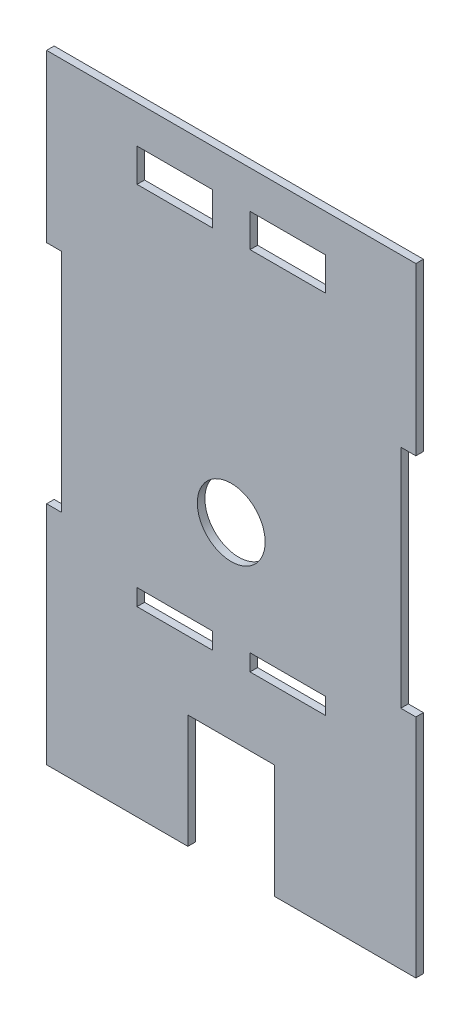
ISO-10303-21;
HEADER;
FILE_DESCRIPTION(('STEP AP214'),'2;1');
FILE_NAME('part.step','',(''),(''),'','','');
FILE_SCHEMA(('AUTOMOTIVE_DESIGN { 1 0 10303 214 1 1 1 1 }'));
ENDSEC;
DATA;
#1=APPLICATION_CONTEXT('core data for automotive mechanical design processes');
#2=APPLICATION_PROTOCOL_DEFINITION('international standard','automotive_design',2000,#1);
#3=PRODUCT_CONTEXT('',#1,'mechanical');
#4=PRODUCT('Part','Part','',(#3));
#5=PRODUCT_RELATED_PRODUCT_CATEGORY('part','',(#4));
#6=PRODUCT_DEFINITION_FORMATION('','',#4);
#7=PRODUCT_DEFINITION_CONTEXT('part definition',#1,'design');
#8=PRODUCT_DEFINITION('design','',#6,#7);
#9=PRODUCT_DEFINITION_SHAPE('','',#8);
#10=(LENGTH_UNIT() NAMED_UNIT(*) SI_UNIT(.MILLI.,.METRE.));
#11=(NAMED_UNIT(*) PLANE_ANGLE_UNIT() SI_UNIT($,.RADIAN.));
#12=(NAMED_UNIT(*) SI_UNIT($,.STERADIAN.) SOLID_ANGLE_UNIT());
#13=UNCERTAINTY_MEASURE_WITH_UNIT(LENGTH_MEASURE(1.E-05),#10,'distance_accuracy_value','');
#14=(GEOMETRIC_REPRESENTATION_CONTEXT(3) GLOBAL_UNCERTAINTY_ASSIGNED_CONTEXT((#13)) GLOBAL_UNIT_ASSIGNED_CONTEXT((#10,
#11,#12)) REPRESENTATION_CONTEXT('',''));
#15=CARTESIAN_POINT('',(0.,0.,0.));
#16=DIRECTION('',(0.,0.,1.));
#17=DIRECTION('',(1.,0.,0.));
#18=AXIS2_PLACEMENT_3D('',#15,#16,#17);
#19=CARTESIAN_POINT('',(0.,85.7257281459209,1.));
#20=DIRECTION('',(0.,1.,0.));
#21=DIRECTION('',(0.,0.,1.));
#22=AXIS2_PLACEMENT_3D('',#19,#20,#21);
#23=PLANE('',#22);
#24=DIRECTION('',(1.,0.,0.));
#25=VECTOR('',#24,1.);
#26=CARTESIAN_POINT('',(0.,85.7257281459209,0.));
#27=LINE('',#26,#25);
#28=CARTESIAN_POINT('',(4.03101287265116,85.7257281459209,0.));
#29=VERTEX_POINT('',#28);
#30=CARTESIAN_POINT('',(53.0310128726682,85.7257281459209,0.));
#31=VERTEX_POINT('',#30);
#32=EDGE_CURVE('E354',#29,#31,#27,.T.);
#33=ORIENTED_EDGE('',*,*,#32,.F.);
#34=DIRECTION('',(0.,0.,-1.));
#35=VECTOR('',#34,1.);
#36=CARTESIAN_POINT('',(4.03101287265116,85.7257281459209,1.));
#37=LINE('',#36,#35);
#38=CARTESIAN_POINT('',(4.03101287265116,85.7257281459209,1.));
#39=VERTEX_POINT('',#38);
#40=EDGE_CURVE('E11',#39,#29,#37,.T.);
#41=ORIENTED_EDGE('',*,*,#40,.F.);
#42=DIRECTION('',(1.,0.,0.));
#43=VECTOR('',#42,1.);
#44=CARTESIAN_POINT('',(0.,85.7257281459209,1.));
#45=LINE('',#44,#43);
#46=CARTESIAN_POINT('',(53.0310128726682,85.7257281459209,1.));
#47=VERTEX_POINT('',#46);
#48=EDGE_CURVE('E576',#39,#47,#45,.T.);
#49=ORIENTED_EDGE('',*,*,#48,.T.);
#50=DIRECTION('',(0.,0.,-1.));
#51=VECTOR('',#50,1.);
#52=CARTESIAN_POINT('',(53.0310128726682,85.7257281459209,1.));
#53=LINE('',#52,#51);
#54=EDGE_CURVE('E59',#47,#31,#53,.T.);
#55=ORIENTED_EDGE('',*,*,#54,.T.);
#56=EDGE_LOOP('',(#33,#41,#49,#55));
#57=FACE_BOUND('',#56,.T.);
#58=ADVANCED_FACE('F39',(#57),#23,.T.);
#59=CARTESIAN_POINT('',(4.03101287265116,0.,1.));
#60=DIRECTION('',(1.,0.,0.));
#61=DIRECTION('',(0.,0.,-1.));
#62=AXIS2_PLACEMENT_3D('',#59,#60,#61);
#63=PLANE('',#62);
#64=DIRECTION('',(0.,-1.,0.));
#65=VECTOR('',#64,1.);
#66=CARTESIAN_POINT('',(4.03101287265116,0.,0.));
#67=LINE('',#66,#65);
#68=CARTESIAN_POINT('',(4.03101287265116,63.6240827319113,0.));
#69=VERTEX_POINT('',#68);
#70=EDGE_CURVE('E357',#29,#69,#67,.T.);
#71=ORIENTED_EDGE('',*,*,#70,.T.);
#72=DIRECTION('',(0.,0.,-1.));
#73=VECTOR('',#72,1.);
#74=CARTESIAN_POINT('',(4.03101287265116,63.6240827319113,1.));
#75=LINE('',#74,#73);
#76=CARTESIAN_POINT('',(4.03101287265116,63.6240827319113,1.));
#77=VERTEX_POINT('',#76);
#78=EDGE_CURVE('E50',#77,#69,#75,.T.);
#79=ORIENTED_EDGE('',*,*,#78,.F.);
#80=DIRECTION('',(0.,-1.,0.));
#81=VECTOR('',#80,1.);
#82=CARTESIAN_POINT('',(4.03101287265116,0.,1.));
#83=LINE('',#82,#81);
#84=EDGE_CURVE('E579',#39,#77,#83,.T.);
#85=ORIENTED_EDGE('',*,*,#84,.F.);
#86=ORIENTED_EDGE('',*,*,#40,.T.);
#87=EDGE_LOOP('',(#71,#79,#85,#86));
#88=FACE_BOUND('',#87,.T.);
#89=ADVANCED_FACE('F644',(#88),#63,.F.);
#90=CARTESIAN_POINT('',(0.,63.6240827319113,1.));
#91=DIRECTION('',(0.,1.,0.));
#92=DIRECTION('',(0.,0.,1.));
#93=AXIS2_PLACEMENT_3D('',#90,#91,#92);
#94=PLANE('',#93);
#95=DIRECTION('',(1.,0.,0.));
#96=VECTOR('',#95,1.);
#97=CARTESIAN_POINT('',(0.,63.6240827319113,0.));
#98=LINE('',#97,#96);
#99=CARTESIAN_POINT('',(6.03101287265113,63.6240827319113,0.));
#100=VERTEX_POINT('',#99);
#101=EDGE_CURVE('E361',#69,#100,#98,.T.);
#102=ORIENTED_EDGE('',*,*,#101,.T.);
#103=DIRECTION('',(0.,0.,-1.));
#104=VECTOR('',#103,1.);
#105=CARTESIAN_POINT('',(6.03101287265113,63.6240827319113,1.));
#106=LINE('',#105,#104);
#107=CARTESIAN_POINT('',(6.03101287265113,63.6240827319113,1.));
#108=VERTEX_POINT('',#107);
#109=EDGE_CURVE('E449',#108,#100,#106,.T.);
#110=ORIENTED_EDGE('',*,*,#109,.F.);
#111=DIRECTION('',(1.,0.,0.));
#112=VECTOR('',#111,1.);
#113=CARTESIAN_POINT('',(0.,63.6240827319113,1.));
#114=LINE('',#113,#112);
#115=EDGE_CURVE('E583',#77,#108,#114,.T.);
#116=ORIENTED_EDGE('',*,*,#115,.F.);
#117=ORIENTED_EDGE('',*,*,#78,.T.);
#118=EDGE_LOOP('',(#102,#110,#116,#117));
#119=FACE_BOUND('',#118,.T.);
#120=ADVANCED_FACE('F649',(#119),#94,.F.);
#121=CARTESIAN_POINT('',(6.03101287265113,0.,1.));
#122=DIRECTION('',(1.,0.,0.));
#123=DIRECTION('',(0.,0.,-1.));
#124=AXIS2_PLACEMENT_3D('',#121,#122,#123);
#125=PLANE('',#124);
#126=DIRECTION('',(0.,-1.,0.));
#127=VECTOR('',#126,1.);
#128=CARTESIAN_POINT('',(6.03101287265113,0.,0.));
#129=LINE('',#128,#127);
#130=CARTESIAN_POINT('',(6.03101287265113,33.6240827319122,0.));
#131=VERTEX_POINT('',#130);
#132=EDGE_CURVE('E365',#100,#131,#129,.T.);
#133=ORIENTED_EDGE('',*,*,#132,.T.);
#134=DIRECTION('',(0.,0.,-1.));
#135=VECTOR('',#134,1.);
#136=CARTESIAN_POINT('',(6.03101287265113,33.6240827319122,1.));
#137=LINE('',#136,#135);
#138=CARTESIAN_POINT('',(6.03101287265113,33.6240827319122,1.));
#139=VERTEX_POINT('',#138);
#140=EDGE_CURVE('E446',#139,#131,#137,.T.);
#141=ORIENTED_EDGE('',*,*,#140,.F.);
#142=DIRECTION('',(0.,-1.,0.));
#143=VECTOR('',#142,1.);
#144=CARTESIAN_POINT('',(6.03101287265113,0.,1.));
#145=LINE('',#144,#143);
#146=EDGE_CURVE('E587',#108,#139,#145,.T.);
#147=ORIENTED_EDGE('',*,*,#146,.F.);
#148=ORIENTED_EDGE('',*,*,#109,.T.);
#149=EDGE_LOOP('',(#133,#141,#147,#148));
#150=FACE_BOUND('',#149,.T.);
#151=ADVANCED_FACE('F922',(#150),#125,.F.);
#152=CARTESIAN_POINT('',(0.,33.6240827319122,1.));
#153=DIRECTION('',(0.,1.,0.));
#154=DIRECTION('',(0.,0.,1.));
#155=AXIS2_PLACEMENT_3D('',#152,#153,#154);
#156=PLANE('',#155);
#157=DIRECTION('',(1.,0.,0.));
#158=VECTOR('',#157,1.);
#159=CARTESIAN_POINT('',(0.,33.6240827319122,0.));
#160=LINE('',#159,#158);
#161=CARTESIAN_POINT('',(4.03101287265116,33.6240827319122,0.));
#162=VERTEX_POINT('',#161);
#163=EDGE_CURVE('E369',#162,#131,#160,.T.);
#164=ORIENTED_EDGE('',*,*,#163,.F.);
#165=DIRECTION('',(0.,0.,-1.));
#166=VECTOR('',#165,1.);
#167=CARTESIAN_POINT('',(4.03101287265116,33.6240827319122,1.));
#168=LINE('',#167,#166);
#169=CARTESIAN_POINT('',(4.03101287265116,33.6240827319122,1.));
#170=VERTEX_POINT('',#169);
#171=EDGE_CURVE('E443',#170,#162,#168,.T.);
#172=ORIENTED_EDGE('',*,*,#171,.F.);
#173=DIRECTION('',(1.,0.,0.));
#174=VECTOR('',#173,1.);
#175=CARTESIAN_POINT('',(0.,33.6240827319122,1.));
#176=LINE('',#175,#174);
#177=EDGE_CURVE('E590',#170,#139,#176,.T.);
#178=ORIENTED_EDGE('',*,*,#177,.T.);
#179=ORIENTED_EDGE('',*,*,#140,.T.);
#180=EDGE_LOOP('',(#164,#172,#178,#179));
#181=FACE_BOUND('',#180,.T.);
#182=ADVANCED_FACE('F911',(#181),#156,.T.);
#183=CARTESIAN_POINT('',(4.03101287265116,0.,1.));
#184=DIRECTION('',(1.,0.,0.));
#185=DIRECTION('',(0.,0.,-1.));
#186=AXIS2_PLACEMENT_3D('',#183,#184,#185);
#187=PLANE('',#186);
#188=DIRECTION('',(0.,-1.,0.));
#189=VECTOR('',#188,1.);
#190=CARTESIAN_POINT('',(4.03101287265116,0.,0.));
#191=LINE('',#190,#189);
#192=CARTESIAN_POINT('',(4.03101287265116,3.62408273191132,0.));
#193=VERTEX_POINT('',#192);
#194=EDGE_CURVE('E373',#162,#193,#191,.T.);
#195=ORIENTED_EDGE('',*,*,#194,.T.);
#196=DIRECTION('',(0.,0.,-1.));
#197=VECTOR('',#196,1.);
#198=CARTESIAN_POINT('',(4.03101287265116,3.62408273191132,1.));
#199=LINE('',#198,#197);
#200=CARTESIAN_POINT('',(4.03101287265116,3.62408273191132,1.));
#201=VERTEX_POINT('',#200);
#202=EDGE_CURVE('E440',#201,#193,#199,.T.);
#203=ORIENTED_EDGE('',*,*,#202,.F.);
#204=DIRECTION('',(0.,-1.,0.));
#205=VECTOR('',#204,1.);
#206=CARTESIAN_POINT('',(4.03101287265116,0.,1.));
#207=LINE('',#206,#205);
#208=EDGE_CURVE('E594',#170,#201,#207,.T.);
#209=ORIENTED_EDGE('',*,*,#208,.F.);
#210=ORIENTED_EDGE('',*,*,#171,.T.);
#211=EDGE_LOOP('',(#195,#203,#209,#210));
#212=FACE_BOUND('',#211,.T.);
#213=ADVANCED_FACE('F901',(#212),#187,.F.);
#214=CARTESIAN_POINT('',(0.,3.62408273191132,1.));
#215=DIRECTION('',(0.,-1.,0.));
#216=DIRECTION('',(0.,0.,-1.));
#217=AXIS2_PLACEMENT_3D('',#214,#215,#216);
#218=PLANE('',#217);
#219=DIRECTION('',(-1.,0.,0.));
#220=VECTOR('',#219,1.);
#221=CARTESIAN_POINT('',(0.,3.62408273191132,0.));
#222=LINE('',#221,#220);
#223=CARTESIAN_POINT('',(22.7810128726682,3.62408273191132,0.));
#224=VERTEX_POINT('',#223);
#225=EDGE_CURVE('E377',#224,#193,#222,.T.);
#226=ORIENTED_EDGE('',*,*,#225,.F.);
#227=DIRECTION('',(0.,0.,-1.));
#228=VECTOR('',#227,1.);
#229=CARTESIAN_POINT('',(22.7810128726682,3.62408273191132,1.));
#230=LINE('',#229,#228);
#231=CARTESIAN_POINT('',(22.7810128726682,3.62408273191132,1.));
#232=VERTEX_POINT('',#231);
#233=EDGE_CURVE('E437',#232,#224,#230,.T.);
#234=ORIENTED_EDGE('',*,*,#233,.F.);
#235=DIRECTION('',(-1.,0.,0.));
#236=VECTOR('',#235,1.);
#237=CARTESIAN_POINT('',(0.,3.62408273191132,1.));
#238=LINE('',#237,#236);
#239=EDGE_CURVE('E597',#232,#201,#238,.T.);
#240=ORIENTED_EDGE('',*,*,#239,.T.);
#241=ORIENTED_EDGE('',*,*,#202,.T.);
#242=EDGE_LOOP('',(#226,#234,#240,#241));
#243=FACE_BOUND('',#242,.T.);
#244=ADVANCED_FACE('F891',(#243),#218,.T.);
#245=CARTESIAN_POINT('',(22.7810128726682,0.,1.));
#246=DIRECTION('',(1.,0.,0.));
#247=DIRECTION('',(0.,0.,-1.));
#248=AXIS2_PLACEMENT_3D('',#245,#246,#247);
#249=PLANE('',#248);
#250=DIRECTION('',(0.,-1.,0.));
#251=VECTOR('',#250,1.);
#252=CARTESIAN_POINT('',(22.7810128726682,0.,0.));
#253=LINE('',#252,#251);
#254=CARTESIAN_POINT('',(22.7810128726682,18.7240827319101,0.));
#255=VERTEX_POINT('',#254);
#256=EDGE_CURVE('E381',#255,#224,#253,.T.);
#257=ORIENTED_EDGE('',*,*,#256,.F.);
#258=DIRECTION('',(0.,0.,-1.));
#259=VECTOR('',#258,1.);
#260=CARTESIAN_POINT('',(22.7810128726682,18.7240827319101,1.));
#261=LINE('',#260,#259);
#262=CARTESIAN_POINT('',(22.7810128726682,18.7240827319101,1.));
#263=VERTEX_POINT('',#262);
#264=EDGE_CURVE('E434',#263,#255,#261,.T.);
#265=ORIENTED_EDGE('',*,*,#264,.F.);
#266=DIRECTION('',(0.,-1.,0.));
#267=VECTOR('',#266,1.);
#268=CARTESIAN_POINT('',(22.7810128726682,0.,1.));
#269=LINE('',#268,#267);
#270=EDGE_CURVE('E601',#263,#232,#269,.T.);
#271=ORIENTED_EDGE('',*,*,#270,.T.);
#272=ORIENTED_EDGE('',*,*,#233,.T.);
#273=EDGE_LOOP('',(#257,#265,#271,#272));
#274=FACE_BOUND('',#273,.T.);
#275=ADVANCED_FACE('F880',(#274),#249,.T.);
#276=CARTESIAN_POINT('',(0.,18.7240827319101,1.));
#277=DIRECTION('',(0.,-1.,0.));
#278=DIRECTION('',(0.,0.,-1.));
#279=AXIS2_PLACEMENT_3D('',#276,#277,#278);
#280=PLANE('',#279);
#281=DIRECTION('',(-1.,0.,0.));
#282=VECTOR('',#281,1.);
#283=CARTESIAN_POINT('',(0.,18.7240827319101,0.));
#284=LINE('',#283,#282);
#285=CARTESIAN_POINT('',(34.2810128726686,18.7240827319101,0.));
#286=VERTEX_POINT('',#285);
#287=EDGE_CURVE('E385',#286,#255,#284,.T.);
#288=ORIENTED_EDGE('',*,*,#287,.F.);
#289=DIRECTION('',(0.,0.,-1.));
#290=VECTOR('',#289,1.);
#291=CARTESIAN_POINT('',(34.2810128726686,18.7240827319101,1.));
#292=LINE('',#291,#290);
#293=CARTESIAN_POINT('',(34.2810128726686,18.7240827319101,1.));
#294=VERTEX_POINT('',#293);
#295=EDGE_CURVE('E431',#294,#286,#292,.T.);
#296=ORIENTED_EDGE('',*,*,#295,.F.);
#297=DIRECTION('',(-1.,0.,0.));
#298=VECTOR('',#297,1.);
#299=CARTESIAN_POINT('',(0.,18.7240827319101,1.));
#300=LINE('',#299,#298);
#301=EDGE_CURVE('E605',#294,#263,#300,.T.);
#302=ORIENTED_EDGE('',*,*,#301,.T.);
#303=ORIENTED_EDGE('',*,*,#264,.T.);
#304=EDGE_LOOP('',(#288,#296,#302,#303));
#305=FACE_BOUND('',#304,.T.);
#306=ADVANCED_FACE('F870',(#305),#280,.T.);
#307=CARTESIAN_POINT('',(34.2810128726686,0.,1.));
#308=DIRECTION('',(-1.,0.,0.));
#309=DIRECTION('',(0.,0.,1.));
#310=AXIS2_PLACEMENT_3D('',#307,#308,#309);
#311=PLANE('',#310);
#312=DIRECTION('',(0.,1.,0.));
#313=VECTOR('',#312,1.);
#314=CARTESIAN_POINT('',(34.2810128726686,0.,0.));
#315=LINE('',#314,#313);
#316=CARTESIAN_POINT('',(34.2810128726686,3.62408273191132,0.));
#317=VERTEX_POINT('',#316);
#318=EDGE_CURVE('E389',#317,#286,#315,.T.);
#319=ORIENTED_EDGE('',*,*,#318,.F.);
#320=DIRECTION('',(0.,0.,-1.));
#321=VECTOR('',#320,1.);
#322=CARTESIAN_POINT('',(34.2810128726686,3.62408273191132,1.));
#323=LINE('',#322,#321);
#324=CARTESIAN_POINT('',(34.2810128726686,3.62408273191132,1.));
#325=VERTEX_POINT('',#324);
#326=EDGE_CURVE('E428',#325,#317,#323,.T.);
#327=ORIENTED_EDGE('',*,*,#326,.F.);
#328=DIRECTION('',(0.,1.,0.));
#329=VECTOR('',#328,1.);
#330=CARTESIAN_POINT('',(34.2810128726686,0.,1.));
#331=LINE('',#330,#329);
#332=EDGE_CURVE('E609',#325,#294,#331,.T.);
#333=ORIENTED_EDGE('',*,*,#332,.T.);
#334=ORIENTED_EDGE('',*,*,#295,.T.);
#335=EDGE_LOOP('',(#319,#327,#333,#334));
#336=FACE_BOUND('',#335,.T.);
#337=ADVANCED_FACE('F861',(#336),#311,.T.);
#338=CARTESIAN_POINT('',(0.,3.62408273191132,1.));
#339=DIRECTION('',(0.,-1.,0.));
#340=DIRECTION('',(0.,0.,-1.));
#341=AXIS2_PLACEMENT_3D('',#338,#339,#340);
#342=PLANE('',#341);
#343=DIRECTION('',(-1.,0.,0.));
#344=VECTOR('',#343,1.);
#345=CARTESIAN_POINT('',(0.,3.62408273191132,0.));
#346=LINE('',#345,#344);
#347=CARTESIAN_POINT('',(53.0310128726682,3.62408273191132,0.));
#348=VERTEX_POINT('',#347);
#349=EDGE_CURVE('E393',#348,#317,#346,.T.);
#350=ORIENTED_EDGE('',*,*,#349,.F.);
#351=DIRECTION('',(0.,0.,-1.));
#352=VECTOR('',#351,1.);
#353=CARTESIAN_POINT('',(53.0310128726682,3.62408273191132,1.));
#354=LINE('',#353,#352);
#355=CARTESIAN_POINT('',(53.0310128726682,3.62408273191132,1.));
#356=VERTEX_POINT('',#355);
#357=EDGE_CURVE('E425',#356,#348,#354,.T.);
#358=ORIENTED_EDGE('',*,*,#357,.F.);
#359=DIRECTION('',(-1.,0.,0.));
#360=VECTOR('',#359,1.);
#361=CARTESIAN_POINT('',(0.,3.62408273191132,1.));
#362=LINE('',#361,#360);
#363=EDGE_CURVE('E613',#356,#325,#362,.T.);
#364=ORIENTED_EDGE('',*,*,#363,.T.);
#365=ORIENTED_EDGE('',*,*,#326,.T.);
#366=EDGE_LOOP('',(#350,#358,#364,#365));
#367=FACE_BOUND('',#366,.T.);
#368=ADVANCED_FACE('F629',(#367),#342,.T.);
#369=CARTESIAN_POINT('',(53.0310128726682,0.,1.));
#370=DIRECTION('',(1.,0.,0.));
#371=DIRECTION('',(0.,0.,-1.));
#372=AXIS2_PLACEMENT_3D('',#369,#370,#371);
#373=PLANE('',#372);
#374=DIRECTION('',(0.,-1.,0.));
#375=VECTOR('',#374,1.);
#376=CARTESIAN_POINT('',(53.0310128726682,0.,0.));
#377=LINE('',#376,#375);
#378=CARTESIAN_POINT('',(53.0310128726682,33.6240827319122,0.));
#379=VERTEX_POINT('',#378);
#380=EDGE_CURVE('E397',#379,#348,#377,.T.);
#381=ORIENTED_EDGE('',*,*,#380,.F.);
#382=DIRECTION('',(0.,0.,-1.));
#383=VECTOR('',#382,1.);
#384=CARTESIAN_POINT('',(53.0310128726682,33.6240827319122,1.));
#385=LINE('',#384,#383);
#386=CARTESIAN_POINT('',(53.0310128726682,33.6240827319122,1.));
#387=VERTEX_POINT('',#386);
#388=EDGE_CURVE('E422',#387,#379,#385,.T.);
#389=ORIENTED_EDGE('',*,*,#388,.F.);
#390=DIRECTION('',(0.,-1.,0.));
#391=VECTOR('',#390,1.);
#392=CARTESIAN_POINT('',(53.0310128726682,0.,1.));
#393=LINE('',#392,#391);
#394=EDGE_CURVE('E617',#387,#356,#393,.T.);
#395=ORIENTED_EDGE('',*,*,#394,.T.);
#396=ORIENTED_EDGE('',*,*,#357,.T.);
#397=EDGE_LOOP('',(#381,#389,#395,#396));
#398=FACE_BOUND('',#397,.T.);
#399=ADVANCED_FACE('F623',(#398),#373,.T.);
#400=CARTESIAN_POINT('',(0.,33.6240827319122,1.));
#401=DIRECTION('',(0.,-1.,0.));
#402=DIRECTION('',(0.,0.,-1.));
#403=AXIS2_PLACEMENT_3D('',#400,#401,#402);
#404=PLANE('',#403);
#405=DIRECTION('',(-1.,0.,0.));
#406=VECTOR('',#405,1.);
#407=CARTESIAN_POINT('',(0.,33.6240827319122,0.));
#408=LINE('',#407,#406);
#409=CARTESIAN_POINT('',(51.0310128726686,33.6240827319122,0.));
#410=VERTEX_POINT('',#409);
#411=EDGE_CURVE('E401',#379,#410,#408,.T.);
#412=ORIENTED_EDGE('',*,*,#411,.T.);
#413=DIRECTION('',(0.,0.,-1.));
#414=VECTOR('',#413,1.);
#415=CARTESIAN_POINT('',(51.0310128726686,33.6240827319122,1.));
#416=LINE('',#415,#414);
#417=CARTESIAN_POINT('',(51.0310128726686,33.6240827319122,1.));
#418=VERTEX_POINT('',#417);
#419=EDGE_CURVE('E267',#418,#410,#416,.T.);
#420=ORIENTED_EDGE('',*,*,#419,.F.);
#421=DIRECTION('',(-1.,0.,0.));
#422=VECTOR('',#421,1.);
#423=CARTESIAN_POINT('',(0.,33.6240827319122,1.));
#424=LINE('',#423,#422);
#425=EDGE_CURVE('E277',#387,#418,#424,.T.);
#426=ORIENTED_EDGE('',*,*,#425,.F.);
#427=ORIENTED_EDGE('',*,*,#388,.T.);
#428=EDGE_LOOP('',(#412,#420,#426,#427));
#429=FACE_BOUND('',#428,.T.);
#430=ADVANCED_FACE('F634',(#429),#404,.F.);
#431=CARTESIAN_POINT('',(51.0310128726686,0.,1.));
#432=DIRECTION('',(1.,0.,0.));
#433=DIRECTION('',(0.,0.,-1.));
#434=AXIS2_PLACEMENT_3D('',#431,#432,#433);
#435=PLANE('',#434);
#436=DIRECTION('',(0.,-1.,0.));
#437=VECTOR('',#436,1.);
#438=CARTESIAN_POINT('',(51.0310128726686,0.,0.));
#439=LINE('',#438,#437);
#440=CARTESIAN_POINT('',(51.0310128726686,63.6240827319113,0.));
#441=VERTEX_POINT('',#440);
#442=EDGE_CURVE('E262',#441,#410,#439,.T.);
#443=ORIENTED_EDGE('',*,*,#442,.F.);
#444=DIRECTION('',(0.,0.,-1.));
#445=VECTOR('',#444,1.);
#446=CARTESIAN_POINT('',(51.0310128726686,63.6240827319113,1.));
#447=LINE('',#446,#445);
#448=CARTESIAN_POINT('',(51.0310128726686,63.6240827319113,1.));
#449=VERTEX_POINT('',#448);
#450=EDGE_CURVE('E257',#449,#441,#447,.T.);
#451=ORIENTED_EDGE('',*,*,#450,.F.);
#452=DIRECTION('',(0.,-1.,0.));
#453=VECTOR('',#452,1.);
#454=CARTESIAN_POINT('',(51.0310128726686,0.,1.));
#455=LINE('',#454,#453);
#456=EDGE_CURVE('E260',#449,#418,#455,.T.);
#457=ORIENTED_EDGE('',*,*,#456,.T.);
#458=ORIENTED_EDGE('',*,*,#419,.T.);
#459=EDGE_LOOP('',(#443,#451,#457,#458));
#460=FACE_BOUND('',#459,.T.);
#461=ADVANCED_FACE('F259',(#460),#435,.T.);
#462=CARTESIAN_POINT('',(0.,63.6240827319113,1.));
#463=DIRECTION('',(0.,-1.,0.));
#464=DIRECTION('',(0.,0.,-1.));
#465=AXIS2_PLACEMENT_3D('',#462,#463,#464);
#466=PLANE('',#465);
#467=DIRECTION('',(-1.,0.,0.));
#468=VECTOR('',#467,1.);
#469=CARTESIAN_POINT('',(0.,63.6240827319113,0.));
#470=LINE('',#469,#468);
#471=CARTESIAN_POINT('',(53.0310128726682,63.6240827319113,0.));
#472=VERTEX_POINT('',#471);
#473=EDGE_CURVE('E407',#472,#441,#470,.T.);
#474=ORIENTED_EDGE('',*,*,#473,.F.);
#475=DIRECTION('',(0.,0.,-1.));
#476=VECTOR('',#475,1.);
#477=CARTESIAN_POINT('',(53.0310128726682,63.6240827319113,1.));
#478=LINE('',#477,#476);
#479=CARTESIAN_POINT('',(53.0310128726682,63.6240827319113,1.));
#480=VERTEX_POINT('',#479);
#481=EDGE_CURVE('E156',#480,#472,#478,.T.);
#482=ORIENTED_EDGE('',*,*,#481,.F.);
#483=DIRECTION('',(-1.,0.,0.));
#484=VECTOR('',#483,1.);
#485=CARTESIAN_POINT('',(0.,63.6240827319113,1.));
#486=LINE('',#485,#484);
#487=EDGE_CURVE('E274',#480,#449,#486,.T.);
#488=ORIENTED_EDGE('',*,*,#487,.T.);
#489=ORIENTED_EDGE('',*,*,#450,.T.);
#490=EDGE_LOOP('',(#474,#482,#488,#489));
#491=FACE_BOUND('',#490,.T.);
#492=ADVANCED_FACE('F281',(#491),#466,.T.);
#493=CARTESIAN_POINT('',(0.,27.7971461282411,1.));
#494=DIRECTION('',(0.,1.,0.));
#495=DIRECTION('',(0.,0.,1.));
#496=AXIS2_PLACEMENT_3D('',#493,#494,#495);
#497=PLANE('',#496);
#498=DIRECTION('',(1.,0.,0.));
#499=VECTOR('',#498,1.);
#500=CARTESIAN_POINT('',(0.,27.7971461282411,0.));
#501=LINE('',#500,#499);
#502=CARTESIAN_POINT('',(31.0310128726649,27.7971461282411,0.));
#503=VERTEX_POINT('',#502);
#504=CARTESIAN_POINT('',(41.0310128726651,27.7971461282411,0.));
#505=VERTEX_POINT('',#504);
#506=EDGE_CURVE('E338',#503,#505,#501,.T.);
#507=ORIENTED_EDGE('',*,*,#506,.F.);
#508=DIRECTION('',(0.,0.,-1.));
#509=VECTOR('',#508,1.);
#510=CARTESIAN_POINT('',(31.0310128726649,27.7971461282411,1.));
#511=LINE('',#510,#509);
#512=CARTESIAN_POINT('',(31.0310128726649,27.7971461282411,1.));
#513=VERTEX_POINT('',#512);
#514=EDGE_CURVE('E417',#513,#503,#511,.T.);
#515=ORIENTED_EDGE('',*,*,#514,.F.);
#516=DIRECTION('',(1.,0.,0.));
#517=VECTOR('',#516,1.);
#518=CARTESIAN_POINT('',(0.,27.7971461282411,1.));
#519=LINE('',#518,#517);
#520=CARTESIAN_POINT('',(41.0310128726651,27.7971461282411,1.));
#521=VERTEX_POINT('',#520);
#522=EDGE_CURVE('E561',#513,#521,#519,.T.);
#523=ORIENTED_EDGE('',*,*,#522,.T.);
#524=DIRECTION('',(0.,0.,-1.));
#525=VECTOR('',#524,1.);
#526=CARTESIAN_POINT('',(41.0310128726651,27.7971461282411,1.));
#527=LINE('',#526,#525);
#528=EDGE_CURVE('E456',#521,#505,#527,.T.);
#529=ORIENTED_EDGE('',*,*,#528,.T.);
#530=EDGE_LOOP('',(#507,#515,#523,#529));
#531=FACE_BOUND('',#530,.T.);
#532=ADVANCED_FACE('F667',(#531),#497,.T.);
#533=CARTESIAN_POINT('',(31.0310128726649,0.,1.));
#534=DIRECTION('',(-1.,0.,0.));
#535=DIRECTION('',(0.,0.,1.));
#536=AXIS2_PLACEMENT_3D('',#533,#534,#535);
#537=PLANE('',#536);
#538=DIRECTION('',(0.,1.,0.));
#539=VECTOR('',#538,1.);
#540=CARTESIAN_POINT('',(31.0310128726649,0.,0.));
#541=LINE('',#540,#539);
#542=CARTESIAN_POINT('',(31.0310128726649,29.9971461282421,0.));
#543=VERTEX_POINT('',#542);
#544=EDGE_CURVE('E342',#503,#543,#541,.T.);
#545=ORIENTED_EDGE('',*,*,#544,.T.);
#546=DIRECTION('',(0.,0.,-1.));
#547=VECTOR('',#546,1.);
#548=CARTESIAN_POINT('',(31.0310128726649,29.9971461282421,1.));
#549=LINE('',#548,#547);
#550=CARTESIAN_POINT('',(31.0310128726649,29.9971461282421,1.));
#551=VERTEX_POINT('',#550);
#552=EDGE_CURVE('E463',#551,#543,#549,.T.);
#553=ORIENTED_EDGE('',*,*,#552,.F.);
#554=DIRECTION('',(0.,1.,0.));
#555=VECTOR('',#554,1.);
#556=CARTESIAN_POINT('',(31.0310128726649,0.,1.));
#557=LINE('',#556,#555);
#558=EDGE_CURVE('E565',#513,#551,#557,.T.);
#559=ORIENTED_EDGE('',*,*,#558,.F.);
#560=ORIENTED_EDGE('',*,*,#514,.T.);
#561=EDGE_LOOP('',(#545,#553,#559,#560));
#562=FACE_BOUND('',#561,.T.);
#563=ADVANCED_FACE('F663',(#562),#537,.F.);
#564=CARTESIAN_POINT('',(0.,29.9971461282421,1.));
#565=DIRECTION('',(0.,-1.,0.));
#566=DIRECTION('',(0.,0.,-1.));
#567=AXIS2_PLACEMENT_3D('',#564,#565,#566);
#568=PLANE('',#567);
#569=DIRECTION('',(-1.,0.,0.));
#570=VECTOR('',#569,1.);
#571=CARTESIAN_POINT('',(0.,29.9971461282421,0.));
#572=LINE('',#571,#570);
#573=CARTESIAN_POINT('',(41.0310128726651,29.9971461282421,0.));
#574=VERTEX_POINT('',#573);
#575=EDGE_CURVE('E346',#574,#543,#572,.T.);
#576=ORIENTED_EDGE('',*,*,#575,.F.);
#577=DIRECTION('',(0.,0.,-1.));
#578=VECTOR('',#577,1.);
#579=CARTESIAN_POINT('',(41.0310128726651,29.9971461282421,1.));
#580=LINE('',#579,#578);
#581=CARTESIAN_POINT('',(41.0310128726651,29.9971461282421,1.));
#582=VERTEX_POINT('',#581);
#583=EDGE_CURVE('E459',#582,#574,#580,.T.);
#584=ORIENTED_EDGE('',*,*,#583,.F.);
#585=DIRECTION('',(-1.,0.,0.));
#586=VECTOR('',#585,1.);
#587=CARTESIAN_POINT('',(0.,29.9971461282421,1.));
#588=LINE('',#587,#586);
#589=EDGE_CURVE('E568',#582,#551,#588,.T.);
#590=ORIENTED_EDGE('',*,*,#589,.T.);
#591=ORIENTED_EDGE('',*,*,#552,.T.);
#592=EDGE_LOOP('',(#576,#584,#590,#591));
#593=FACE_BOUND('',#592,.T.);
#594=ADVANCED_FACE('F659',(#593),#568,.T.);
#595=CARTESIAN_POINT('',(26.031012872671,0.,1.));
#596=DIRECTION('',(-1.,0.,0.));
#597=DIRECTION('',(0.,0.,1.));
#598=AXIS2_PLACEMENT_3D('',#595,#596,#597);
#599=PLANE('',#598);
#600=DIRECTION('',(0.,1.,0.));
#601=VECTOR('',#600,1.);
#602=CARTESIAN_POINT('',(26.031012872671,0.,0.));
#603=LINE('',#602,#601);
#604=CARTESIAN_POINT('',(26.031012872671,27.7971461282411,0.));
#605=VERTEX_POINT('',#604);
#606=CARTESIAN_POINT('',(26.031012872671,29.9971461282421,0.));
#607=VERTEX_POINT('',#606);
#608=EDGE_CURVE('E322',#605,#607,#603,.T.);
#609=ORIENTED_EDGE('',*,*,#608,.F.);
#610=DIRECTION('',(0.,0.,-1.));
#611=VECTOR('',#610,1.);
#612=CARTESIAN_POINT('',(26.031012872671,27.7971461282411,1.));
#613=LINE('',#612,#611);
#614=CARTESIAN_POINT('',(26.031012872671,27.7971461282411,1.));
#615=VERTEX_POINT('',#614);
#616=EDGE_CURVE('E460',#615,#605,#613,.T.);
#617=ORIENTED_EDGE('',*,*,#616,.F.);
#618=DIRECTION('',(0.,1.,0.));
#619=VECTOR('',#618,1.);
#620=CARTESIAN_POINT('',(26.031012872671,0.,1.));
#621=LINE('',#620,#619);
#622=CARTESIAN_POINT('',(26.031012872671,29.9971461282421,1.));
#623=VERTEX_POINT('',#622);
#624=EDGE_CURVE('E546',#615,#623,#621,.T.);
#625=ORIENTED_EDGE('',*,*,#624,.T.);
#626=DIRECTION('',(0.,0.,-1.));
#627=VECTOR('',#626,1.);
#628=CARTESIAN_POINT('',(26.031012872671,29.9971461282421,1.));
#629=LINE('',#628,#627);
#630=EDGE_CURVE('E468',#623,#607,#629,.T.);
#631=ORIENTED_EDGE('',*,*,#630,.T.);
#632=EDGE_LOOP('',(#609,#617,#625,#631));
#633=FACE_BOUND('',#632,.T.);
#634=ADVANCED_FACE('F662',(#633),#599,.T.);
#635=CARTESIAN_POINT('',(0.,27.7971461282411,1.));
#636=DIRECTION('',(0.,-1.,0.));
#637=DIRECTION('',(0.,0.,-1.));
#638=AXIS2_PLACEMENT_3D('',#635,#636,#637);
#639=PLANE('',#638);
#640=DIRECTION('',(-1.,0.,0.));
#641=VECTOR('',#640,1.);
#642=CARTESIAN_POINT('',(0.,27.7971461282411,0.));
#643=LINE('',#642,#641);
#644=CARTESIAN_POINT('',(16.0310128726719,27.7971461282411,0.));
#645=VERTEX_POINT('',#644);
#646=EDGE_CURVE('E326',#605,#645,#643,.T.);
#647=ORIENTED_EDGE('',*,*,#646,.T.);
#648=DIRECTION('',(0.,0.,-1.));
#649=VECTOR('',#648,1.);
#650=CARTESIAN_POINT('',(16.0310128726719,27.7971461282411,1.));
#651=LINE('',#650,#649);
#652=CARTESIAN_POINT('',(16.0310128726719,27.7971461282411,1.));
#653=VERTEX_POINT('',#652);
#654=EDGE_CURVE('E475',#653,#645,#651,.T.);
#655=ORIENTED_EDGE('',*,*,#654,.F.);
#656=DIRECTION('',(-1.,0.,0.));
#657=VECTOR('',#656,1.);
#658=CARTESIAN_POINT('',(0.,27.7971461282411,1.));
#659=LINE('',#658,#657);
#660=EDGE_CURVE('E550',#615,#653,#659,.T.);
#661=ORIENTED_EDGE('',*,*,#660,.F.);
#662=ORIENTED_EDGE('',*,*,#616,.T.);
#663=EDGE_LOOP('',(#647,#655,#661,#662));
#664=FACE_BOUND('',#663,.T.);
#665=ADVANCED_FACE('F680',(#664),#639,.F.);
#666=CARTESIAN_POINT('',(16.0310128726719,0.,1.));
#667=DIRECTION('',(-1.,0.,0.));
#668=DIRECTION('',(0.,0.,1.));
#669=AXIS2_PLACEMENT_3D('',#666,#667,#668);
#670=PLANE('',#669);
#671=DIRECTION('',(0.,1.,0.));
#672=VECTOR('',#671,1.);
#673=CARTESIAN_POINT('',(16.0310128726719,0.,0.));
#674=LINE('',#673,#672);
#675=CARTESIAN_POINT('',(16.0310128726719,29.9971461282421,0.));
#676=VERTEX_POINT('',#675);
#677=EDGE_CURVE('E330',#645,#676,#674,.T.);
#678=ORIENTED_EDGE('',*,*,#677,.T.);
#679=DIRECTION('',(0.,0.,-1.));
#680=VECTOR('',#679,1.);
#681=CARTESIAN_POINT('',(16.0310128726719,29.9971461282421,1.));
#682=LINE('',#681,#680);
#683=CARTESIAN_POINT('',(16.0310128726719,29.9971461282421,1.));
#684=VERTEX_POINT('',#683);
#685=EDGE_CURVE('E471',#684,#676,#682,.T.);
#686=ORIENTED_EDGE('',*,*,#685,.F.);
#687=DIRECTION('',(0.,1.,0.));
#688=VECTOR('',#687,1.);
#689=CARTESIAN_POINT('',(16.0310128726719,0.,1.));
#690=LINE('',#689,#688);
#691=EDGE_CURVE('E554',#653,#684,#690,.T.);
#692=ORIENTED_EDGE('',*,*,#691,.F.);
#693=ORIENTED_EDGE('',*,*,#654,.T.);
#694=EDGE_LOOP('',(#678,#686,#692,#693));
#695=FACE_BOUND('',#694,.T.);
#696=ADVANCED_FACE('F676',(#695),#670,.F.);
#697=CARTESIAN_POINT('',(26.0310128726686,0.,1.));
#698=DIRECTION('',(1.,0.,0.));
#699=DIRECTION('',(0.,0.,-1.));
#700=AXIS2_PLACEMENT_3D('',#697,#698,#699);
#701=PLANE('',#700);
#702=DIRECTION('',(0.,-1.,0.));
#703=VECTOR('',#702,1.);
#704=CARTESIAN_POINT('',(26.0310128726686,0.,0.));
#705=LINE('',#704,#703);
#706=CARTESIAN_POINT('',(26.0310128726686,80.7257281459207,0.));
#707=VERTEX_POINT('',#706);
#708=CARTESIAN_POINT('',(26.0310128726686,76.3257281459206,0.));
#709=VERTEX_POINT('',#708);
#710=EDGE_CURVE('E307',#707,#709,#705,.T.);
#711=ORIENTED_EDGE('',*,*,#710,.T.);
#712=DIRECTION('',(0.,0.,-1.));
#713=VECTOR('',#712,1.);
#714=CARTESIAN_POINT('',(26.0310128726686,76.3257281459206,1.));
#715=LINE('',#714,#713);
#716=CARTESIAN_POINT('',(26.0310128726686,76.3257281459206,1.));
#717=VERTEX_POINT('',#716);
#718=EDGE_CURVE('E472',#717,#709,#715,.T.);
#719=ORIENTED_EDGE('',*,*,#718,.F.);
#720=DIRECTION('',(0.,-1.,0.));
#721=VECTOR('',#720,1.);
#722=CARTESIAN_POINT('',(26.0310128726686,0.,1.));
#723=LINE('',#722,#721);
#724=CARTESIAN_POINT('',(26.0310128726686,80.7257281459207,1.));
#725=VERTEX_POINT('',#724);
#726=EDGE_CURVE('E526',#725,#717,#723,.T.);
#727=ORIENTED_EDGE('',*,*,#726,.F.);
#728=DIRECTION('',(0.,0.,-1.));
#729=VECTOR('',#728,1.);
#730=CARTESIAN_POINT('',(26.0310128726686,80.7257281459207,1.));
#731=LINE('',#730,#729);
#732=EDGE_CURVE('E481',#725,#707,#731,.T.);
#733=ORIENTED_EDGE('',*,*,#732,.T.);
#734=EDGE_LOOP('',(#711,#719,#727,#733));
#735=FACE_BOUND('',#734,.T.);
#736=ADVANCED_FACE('F679',(#735),#701,.F.);
#737=CARTESIAN_POINT('',(0.,76.3257281459206,1.));
#738=DIRECTION('',(0.,-1.,0.));
#739=DIRECTION('',(0.,0.,-1.));
#740=AXIS2_PLACEMENT_3D('',#737,#738,#739);
#741=PLANE('',#740);
#742=DIRECTION('',(-1.,0.,0.));
#743=VECTOR('',#742,1.);
#744=CARTESIAN_POINT('',(0.,76.3257281459206,0.));
#745=LINE('',#744,#743);
#746=CARTESIAN_POINT('',(16.0310128726684,76.3257281459206,0.));
#747=VERTEX_POINT('',#746);
#748=EDGE_CURVE('E311',#709,#747,#745,.T.);
#749=ORIENTED_EDGE('',*,*,#748,.T.);
#750=DIRECTION('',(0.,0.,-1.));
#751=VECTOR('',#750,1.);
#752=CARTESIAN_POINT('',(16.0310128726684,76.3257281459206,1.));
#753=LINE('',#752,#751);
#754=CARTESIAN_POINT('',(16.0310128726684,76.3257281459206,1.));
#755=VERTEX_POINT('',#754);
#756=EDGE_CURVE('E488',#755,#747,#753,.T.);
#757=ORIENTED_EDGE('',*,*,#756,.F.);
#758=DIRECTION('',(-1.,0.,0.));
#759=VECTOR('',#758,1.);
#760=CARTESIAN_POINT('',(0.,76.3257281459206,1.));
#761=LINE('',#760,#759);
#762=EDGE_CURVE('E532',#717,#755,#761,.T.);
#763=ORIENTED_EDGE('',*,*,#762,.F.);
#764=ORIENTED_EDGE('',*,*,#718,.T.);
#765=EDGE_LOOP('',(#749,#757,#763,#764));
#766=FACE_BOUND('',#765,.T.);
#767=ADVANCED_FACE('F694',(#766),#741,.F.);
#768=CARTESIAN_POINT('',(16.0310128726684,0.,1.));
#769=DIRECTION('',(1.,0.,0.));
#770=DIRECTION('',(0.,0.,-1.));
#771=AXIS2_PLACEMENT_3D('',#768,#769,#770);
#772=PLANE('',#771);
#773=DIRECTION('',(0.,-1.,0.));
#774=VECTOR('',#773,1.);
#775=CARTESIAN_POINT('',(16.0310128726684,0.,0.));
#776=LINE('',#775,#774);
#777=CARTESIAN_POINT('',(16.0310128726684,80.7257281459207,0.));
#778=VERTEX_POINT('',#777);
#779=EDGE_CURVE('E315',#778,#747,#776,.T.);
#780=ORIENTED_EDGE('',*,*,#779,.F.);
#781=DIRECTION('',(0.,0.,-1.));
#782=VECTOR('',#781,1.);
#783=CARTESIAN_POINT('',(16.0310128726684,80.7257281459207,1.));
#784=LINE('',#783,#782);
#785=CARTESIAN_POINT('',(16.0310128726684,80.7257281459207,1.));
#786=VERTEX_POINT('',#785);
#787=EDGE_CURVE('E485',#786,#778,#784,.T.);
#788=ORIENTED_EDGE('',*,*,#787,.F.);
#789=DIRECTION('',(0.,-1.,0.));
#790=VECTOR('',#789,1.);
#791=CARTESIAN_POINT('',(16.0310128726684,0.,1.));
#792=LINE('',#791,#790);
#793=EDGE_CURVE('E539',#786,#755,#792,.T.);
#794=ORIENTED_EDGE('',*,*,#793,.T.);
#795=ORIENTED_EDGE('',*,*,#756,.T.);
#796=EDGE_LOOP('',(#780,#788,#794,#795));
#797=FACE_BOUND('',#796,.T.);
#798=ADVANCED_FACE('F691',(#797),#772,.T.);
#799=CARTESIAN_POINT('',(41.0310128726686,0.,1.));
#800=DIRECTION('',(1.,0.,0.));
#801=DIRECTION('',(0.,0.,-1.));
#802=AXIS2_PLACEMENT_3D('',#799,#800,#801);
#803=PLANE('',#802);
#804=DIRECTION('',(0.,-1.,0.));
#805=VECTOR('',#804,1.);
#806=CARTESIAN_POINT('',(41.0310128726686,0.,0.));
#807=LINE('',#806,#805);
#808=CARTESIAN_POINT('',(41.0310128726686,80.7257281459207,0.));
#809=VERTEX_POINT('',#808);
#810=CARTESIAN_POINT('',(41.0310128726686,76.3257281459206,0.));
#811=VERTEX_POINT('',#810);
#812=EDGE_CURVE('E294',#809,#811,#807,.T.);
#813=ORIENTED_EDGE('',*,*,#812,.T.);
#814=DIRECTION('',(0.,0.,-1.));
#815=VECTOR('',#814,1.);
#816=CARTESIAN_POINT('',(41.0310128726686,76.3257281459206,1.));
#817=LINE('',#816,#815);
#818=CARTESIAN_POINT('',(41.0310128726686,76.3257281459206,1.));
#819=VERTEX_POINT('',#818);
#820=EDGE_CURVE('E43',#819,#811,#817,.T.);
#821=ORIENTED_EDGE('',*,*,#820,.F.);
#822=DIRECTION('',(0.,-1.,0.));
#823=VECTOR('',#822,1.);
#824=CARTESIAN_POINT('',(41.0310128726686,0.,1.));
#825=LINE('',#824,#823);
#826=CARTESIAN_POINT('',(41.0310128726686,80.7257281459207,1.));
#827=VERTEX_POINT('',#826);
#828=EDGE_CURVE('E994',#827,#819,#825,.T.);
#829=ORIENTED_EDGE('',*,*,#828,.F.);
#830=DIRECTION('',(0.,0.,-1.));
#831=VECTOR('',#830,1.);
#832=CARTESIAN_POINT('',(41.0310128726686,80.7257281459207,1.));
#833=LINE('',#832,#831);
#834=EDGE_CURVE('E286',#827,#809,#833,.T.);
#835=ORIENTED_EDGE('',*,*,#834,.T.);
#836=EDGE_LOOP('',(#813,#821,#829,#835));
#837=FACE_BOUND('',#836,.T.);
#838=ADVANCED_FACE('F512',(#837),#803,.F.);
#839=CARTESIAN_POINT('',(0.,76.3257281459206,1.));
#840=DIRECTION('',(0.,-1.,0.));
#841=DIRECTION('',(0.,0.,-1.));
#842=AXIS2_PLACEMENT_3D('',#839,#840,#841);
#843=PLANE('',#842);
#844=DIRECTION('',(-1.,0.,0.));
#845=VECTOR('',#844,1.);
#846=CARTESIAN_POINT('',(0.,76.3257281459206,0.));
#847=LINE('',#846,#845);
#848=CARTESIAN_POINT('',(31.0310128726686,76.3257281459206,0.));
#849=VERTEX_POINT('',#848);
#850=EDGE_CURVE('E298',#811,#849,#847,.T.);
#851=ORIENTED_EDGE('',*,*,#850,.T.);
#852=DIRECTION('',(0.,0.,-1.));
#853=VECTOR('',#852,1.);
#854=CARTESIAN_POINT('',(31.0310128726686,76.3257281459206,1.));
#855=LINE('',#854,#853);
#856=CARTESIAN_POINT('',(31.0310128726686,76.3257281459206,1.));
#857=VERTEX_POINT('',#856);
#858=EDGE_CURVE('E500',#857,#849,#855,.T.);
#859=ORIENTED_EDGE('',*,*,#858,.F.);
#860=DIRECTION('',(-1.,0.,0.));
#861=VECTOR('',#860,1.);
#862=CARTESIAN_POINT('',(0.,76.3257281459206,1.));
#863=LINE('',#862,#861);
#864=EDGE_CURVE('E169',#819,#857,#863,.T.);
#865=ORIENTED_EDGE('',*,*,#864,.F.);
#866=ORIENTED_EDGE('',*,*,#820,.T.);
#867=EDGE_LOOP('',(#851,#859,#865,#866));
#868=FACE_BOUND('',#867,.T.);
#869=ADVANCED_FACE('F508',(#868),#843,.F.);
#870=CARTESIAN_POINT('',(31.0310128726686,0.,1.));
#871=DIRECTION('',(-1.,0.,0.));
#872=DIRECTION('',(0.,0.,1.));
#873=AXIS2_PLACEMENT_3D('',#870,#871,#872);
#874=PLANE('',#873);
#875=DIRECTION('',(0.,1.,0.));
#876=VECTOR('',#875,1.);
#877=CARTESIAN_POINT('',(31.0310128726686,0.,0.));
#878=LINE('',#877,#876);
#879=CARTESIAN_POINT('',(31.0310128726686,80.7257281459207,0.));
#880=VERTEX_POINT('',#879);
#881=EDGE_CURVE('E301',#849,#880,#878,.T.);
#882=ORIENTED_EDGE('',*,*,#881,.T.);
#883=DIRECTION('',(0.,0.,-1.));
#884=VECTOR('',#883,1.);
#885=CARTESIAN_POINT('',(31.0310128726686,80.7257281459207,1.));
#886=LINE('',#885,#884);
#887=CARTESIAN_POINT('',(31.0310128726686,80.7257281459207,1.));
#888=VERTEX_POINT('',#887);
#889=EDGE_CURVE('E497',#888,#880,#886,.T.);
#890=ORIENTED_EDGE('',*,*,#889,.F.);
#891=DIRECTION('',(0.,1.,0.));
#892=VECTOR('',#891,1.);
#893=CARTESIAN_POINT('',(31.0310128726686,0.,1.));
#894=LINE('',#893,#892);
#895=EDGE_CURVE('E527',#857,#888,#894,.T.);
#896=ORIENTED_EDGE('',*,*,#895,.F.);
#897=ORIENTED_EDGE('',*,*,#858,.T.);
#898=EDGE_LOOP('',(#882,#890,#896,#897));
#899=FACE_BOUND('',#898,.T.);
#900=ADVANCED_FACE('F519',(#899),#874,.F.);
#901=CARTESIAN_POINT('',(41.0310128726651,0.,1.));
#902=DIRECTION('',(-1.,0.,0.));
#903=DIRECTION('',(0.,0.,1.));
#904=AXIS2_PLACEMENT_3D('',#901,#902,#903);
#905=PLANE('',#904);
#906=DIRECTION('',(0.,1.,0.));
#907=VECTOR('',#906,1.);
#908=CARTESIAN_POINT('',(41.0310128726651,0.,0.));
#909=LINE('',#908,#907);
#910=EDGE_CURVE('E350',#505,#574,#909,.T.);
#911=ORIENTED_EDGE('',*,*,#910,.F.);
#912=ORIENTED_EDGE('',*,*,#528,.F.);
#913=DIRECTION('',(0.,1.,0.));
#914=VECTOR('',#913,1.);
#915=CARTESIAN_POINT('',(41.0310128726651,0.,1.));
#916=LINE('',#915,#914);
#917=EDGE_CURVE('E572',#521,#582,#916,.T.);
#918=ORIENTED_EDGE('',*,*,#917,.T.);
#919=ORIENTED_EDGE('',*,*,#583,.T.);
#920=EDGE_LOOP('',(#911,#912,#918,#919));
#921=FACE_BOUND('',#920,.T.);
#922=ADVANCED_FACE('F654',(#921),#905,.T.);
#923=CARTESIAN_POINT('',(0.,29.9971461282421,1.));
#924=DIRECTION('',(0.,-1.,0.));
#925=DIRECTION('',(0.,0.,-1.));
#926=AXIS2_PLACEMENT_3D('',#923,#924,#925);
#927=PLANE('',#926);
#928=DIRECTION('',(-1.,0.,0.));
#929=VECTOR('',#928,1.);
#930=CARTESIAN_POINT('',(0.,29.9971461282421,0.));
#931=LINE('',#930,#929);
#932=EDGE_CURVE('E334',#607,#676,#931,.T.);
#933=ORIENTED_EDGE('',*,*,#932,.F.);
#934=ORIENTED_EDGE('',*,*,#630,.F.);
#935=DIRECTION('',(-1.,0.,0.));
#936=VECTOR('',#935,1.);
#937=CARTESIAN_POINT('',(0.,29.9971461282421,1.));
#938=LINE('',#937,#936);
#939=EDGE_CURVE('E557',#623,#684,#938,.T.);
#940=ORIENTED_EDGE('',*,*,#939,.T.);
#941=ORIENTED_EDGE('',*,*,#685,.T.);
#942=EDGE_LOOP('',(#933,#934,#940,#941));
#943=FACE_BOUND('',#942,.T.);
#944=ADVANCED_FACE('F657',(#943),#927,.T.);
#945=CARTESIAN_POINT('',(0.,80.7257281459207,1.));
#946=DIRECTION('',(0.,1.,0.));
#947=DIRECTION('',(0.,0.,1.));
#948=AXIS2_PLACEMENT_3D('',#945,#946,#947);
#949=PLANE('',#948);
#950=DIRECTION('',(1.,0.,0.));
#951=VECTOR('',#950,1.);
#952=CARTESIAN_POINT('',(0.,80.7257281459207,0.));
#953=LINE('',#952,#951);
#954=EDGE_CURVE('E319',#778,#707,#953,.T.);
#955=ORIENTED_EDGE('',*,*,#954,.T.);
#956=ORIENTED_EDGE('',*,*,#732,.F.);
#957=DIRECTION('',(1.,0.,0.));
#958=VECTOR('',#957,1.);
#959=CARTESIAN_POINT('',(0.,80.7257281459207,1.));
#960=LINE('',#959,#958);
#961=EDGE_CURVE('E543',#786,#725,#960,.T.);
#962=ORIENTED_EDGE('',*,*,#961,.F.);
#963=ORIENTED_EDGE('',*,*,#787,.T.);
#964=EDGE_LOOP('',(#955,#956,#962,#963));
#965=FACE_BOUND('',#964,.T.);
#966=ADVANCED_FACE('F674',(#965),#949,.F.);
#967=CARTESIAN_POINT('',(0.,80.7257281459207,1.));
#968=DIRECTION('',(0.,1.,0.));
#969=DIRECTION('',(0.,0.,1.));
#970=AXIS2_PLACEMENT_3D('',#967,#968,#969);
#971=PLANE('',#970);
#972=DIRECTION('',(1.,0.,0.));
#973=VECTOR('',#972,1.);
#974=CARTESIAN_POINT('',(0.,80.7257281459207,0.));
#975=LINE('',#974,#973);
#976=EDGE_CURVE('E304',#880,#809,#975,.T.);
#977=ORIENTED_EDGE('',*,*,#976,.T.);
#978=ORIENTED_EDGE('',*,*,#834,.F.);
#979=DIRECTION('',(1.,0.,0.));
#980=VECTOR('',#979,1.);
#981=CARTESIAN_POINT('',(0.,80.7257281459207,1.));
#982=LINE('',#981,#980);
#983=EDGE_CURVE('E523',#888,#827,#982,.T.);
#984=ORIENTED_EDGE('',*,*,#983,.F.);
#985=ORIENTED_EDGE('',*,*,#889,.T.);
#986=EDGE_LOOP('',(#977,#978,#984,#985));
#987=FACE_BOUND('',#986,.T.);
#988=ADVANCED_FACE('F522',(#987),#971,.F.);
#989=CARTESIAN_POINT('',(28.5310128726686,43.7240827319101,1.));
#990=DIRECTION('',(0.,0.,-1.));
#991=DIRECTION('',(-1.,0.,0.));
#992=AXIS2_PLACEMENT_3D('',#989,#990,#991);
#993=CYLINDRICAL_SURFACE('',#992,4.5);
#994=CARTESIAN_POINT('',(28.5310128726686,43.7240827319101,1.));
#995=DIRECTION('',(0.,0.,1.));
#996=DIRECTION('',(1.,0.,0.));
#997=AXIS2_PLACEMENT_3D('',#994,#995,#996);
#998=CIRCLE('',#997,4.5);
#999=CARTESIAN_POINT('',(33.0310128726686,43.7240827319101,1.));
#1000=VERTEX_POINT('',#999);
#1001=EDGE_CURVE('E414',#1000,#1000,#998,.T.);
#1002=ORIENTED_EDGE('',*,*,#1001,.T.);
#1003=EDGE_LOOP('',(#1002));
#1004=FACE_BOUND('',#1003,.T.);
#1005=CARTESIAN_POINT('',(28.5310128726686,43.7240827319101,0.));
#1006=DIRECTION('',(0.,0.,1.));
#1007=DIRECTION('',(1.,0.,0.));
#1008=AXIS2_PLACEMENT_3D('',#1005,#1006,#1007);
#1009=CIRCLE('',#1008,4.5);
#1010=CARTESIAN_POINT('',(33.0310128726686,43.7240827319101,0.));
#1011=VERTEX_POINT('',#1010);
#1012=EDGE_CURVE('E290',#1011,#1011,#1009,.T.);
#1013=ORIENTED_EDGE('',*,*,#1012,.F.);
#1014=EDGE_LOOP('',(#1013));
#1015=FACE_BOUND('',#1014,.T.);
#1016=ADVANCED_FACE('F41',(#1004,#1015),#993,.F.);
#1017=CARTESIAN_POINT('',(53.0310128726682,0.,1.));
#1018=DIRECTION('',(1.,0.,0.));
#1019=DIRECTION('',(0.,0.,-1.));
#1020=AXIS2_PLACEMENT_3D('',#1017,#1018,#1019);
#1021=PLANE('',#1020);
#1022=DIRECTION('',(0.,-1.,0.));
#1023=VECTOR('',#1022,1.);
#1024=CARTESIAN_POINT('',(53.0310128726682,0.,0.));
#1025=LINE('',#1024,#1023);
#1026=EDGE_CURVE('E410',#31,#472,#1025,.T.);
#1027=ORIENTED_EDGE('',*,*,#1026,.F.);
#1028=ORIENTED_EDGE('',*,*,#54,.F.);
#1029=DIRECTION('',(0.,-1.,0.));
#1030=VECTOR('',#1029,1.);
#1031=CARTESIAN_POINT('',(53.0310128726682,0.,1.));
#1032=LINE('',#1031,#1030);
#1033=EDGE_CURVE('E283',#47,#480,#1032,.T.);
#1034=ORIENTED_EDGE('',*,*,#1033,.T.);
#1035=ORIENTED_EDGE('',*,*,#481,.T.);
#1036=EDGE_LOOP('',(#1027,#1028,#1034,#1035));
#1037=FACE_BOUND('',#1036,.T.);
#1038=ADVANCED_FACE('F742',(#1037),#1021,.T.);
#1039=CARTESIAN_POINT('',(0.,0.,1.));
#1040=DIRECTION('',(0.,0.,1.));
#1041=DIRECTION('',(1.,0.,0.));
#1042=AXIS2_PLACEMENT_3D('',#1039,#1040,#1041);
#1043=PLANE('',#1042);
#1044=ORIENTED_EDGE('',*,*,#1001,.F.);
#1045=EDGE_LOOP('',(#1044));
#1046=FACE_BOUND('',#1045,.T.);
#1047=ORIENTED_EDGE('',*,*,#828,.T.);
#1048=ORIENTED_EDGE('',*,*,#864,.T.);
#1049=ORIENTED_EDGE('',*,*,#895,.T.);
#1050=ORIENTED_EDGE('',*,*,#983,.T.);
#1051=EDGE_LOOP('',(#1047,#1048,#1049,#1050));
#1052=FACE_BOUND('',#1051,.T.);
#1053=ORIENTED_EDGE('',*,*,#726,.T.);
#1054=ORIENTED_EDGE('',*,*,#762,.T.);
#1055=ORIENTED_EDGE('',*,*,#793,.F.);
#1056=ORIENTED_EDGE('',*,*,#961,.T.);
#1057=EDGE_LOOP('',(#1053,#1054,#1055,#1056));
#1058=FACE_BOUND('',#1057,.T.);
#1059=ORIENTED_EDGE('',*,*,#624,.F.);
#1060=ORIENTED_EDGE('',*,*,#660,.T.);
#1061=ORIENTED_EDGE('',*,*,#691,.T.);
#1062=ORIENTED_EDGE('',*,*,#939,.F.);
#1063=EDGE_LOOP('',(#1059,#1060,#1061,#1062));
#1064=FACE_BOUND('',#1063,.T.);
#1065=ORIENTED_EDGE('',*,*,#522,.F.);
#1066=ORIENTED_EDGE('',*,*,#558,.T.);
#1067=ORIENTED_EDGE('',*,*,#589,.F.);
#1068=ORIENTED_EDGE('',*,*,#917,.F.);
#1069=EDGE_LOOP('',(#1065,#1066,#1067,#1068));
#1070=FACE_BOUND('',#1069,.T.);
#1071=ORIENTED_EDGE('',*,*,#48,.F.);
#1072=ORIENTED_EDGE('',*,*,#84,.T.);
#1073=ORIENTED_EDGE('',*,*,#115,.T.);
#1074=ORIENTED_EDGE('',*,*,#146,.T.);
#1075=ORIENTED_EDGE('',*,*,#177,.F.);
#1076=ORIENTED_EDGE('',*,*,#208,.T.);
#1077=ORIENTED_EDGE('',*,*,#239,.F.);
#1078=ORIENTED_EDGE('',*,*,#270,.F.);
#1079=ORIENTED_EDGE('',*,*,#301,.F.);
#1080=ORIENTED_EDGE('',*,*,#332,.F.);
#1081=ORIENTED_EDGE('',*,*,#363,.F.);
#1082=ORIENTED_EDGE('',*,*,#394,.F.);
#1083=ORIENTED_EDGE('',*,*,#425,.T.);
#1084=ORIENTED_EDGE('',*,*,#456,.F.);
#1085=ORIENTED_EDGE('',*,*,#487,.F.);
#1086=ORIENTED_EDGE('',*,*,#1033,.F.);
#1087=EDGE_LOOP('',(#1071,#1072,#1073,#1074,#1075,#1076,#1077,#1078,#1079,#1080,#1081,#1082,
#1083,#1084,#1085,#1086));
#1088=FACE_BOUND('',#1087,.T.);
#1089=ADVANCED_FACE('F272',(#1046,#1052,#1058,#1064,#1070,#1088),#1043,.T.);
#1090=CARTESIAN_POINT('',(0.,0.,0.));
#1091=DIRECTION('',(0.,0.,1.));
#1092=DIRECTION('',(1.,0.,0.));
#1093=AXIS2_PLACEMENT_3D('',#1090,#1091,#1092);
#1094=PLANE('',#1093);
#1095=ORIENTED_EDGE('',*,*,#1012,.T.);
#1096=EDGE_LOOP('',(#1095));
#1097=FACE_BOUND('',#1096,.T.);
#1098=ORIENTED_EDGE('',*,*,#812,.F.);
#1099=ORIENTED_EDGE('',*,*,#976,.F.);
#1100=ORIENTED_EDGE('',*,*,#881,.F.);
#1101=ORIENTED_EDGE('',*,*,#850,.F.);
#1102=EDGE_LOOP('',(#1098,#1099,#1100,#1101));
#1103=FACE_BOUND('',#1102,.T.);
#1104=ORIENTED_EDGE('',*,*,#710,.F.);
#1105=ORIENTED_EDGE('',*,*,#954,.F.);
#1106=ORIENTED_EDGE('',*,*,#779,.T.);
#1107=ORIENTED_EDGE('',*,*,#748,.F.);
#1108=EDGE_LOOP('',(#1104,#1105,#1106,#1107));
#1109=FACE_BOUND('',#1108,.T.);
#1110=ORIENTED_EDGE('',*,*,#608,.T.);
#1111=ORIENTED_EDGE('',*,*,#932,.T.);
#1112=ORIENTED_EDGE('',*,*,#677,.F.);
#1113=ORIENTED_EDGE('',*,*,#646,.F.);
#1114=EDGE_LOOP('',(#1110,#1111,#1112,#1113));
#1115=FACE_BOUND('',#1114,.T.);
#1116=ORIENTED_EDGE('',*,*,#506,.T.);
#1117=ORIENTED_EDGE('',*,*,#910,.T.);
#1118=ORIENTED_EDGE('',*,*,#575,.T.);
#1119=ORIENTED_EDGE('',*,*,#544,.F.);
#1120=EDGE_LOOP('',(#1116,#1117,#1118,#1119));
#1121=FACE_BOUND('',#1120,.T.);
#1122=ORIENTED_EDGE('',*,*,#32,.T.);
#1123=ORIENTED_EDGE('',*,*,#1026,.T.);
#1124=ORIENTED_EDGE('',*,*,#473,.T.);
#1125=ORIENTED_EDGE('',*,*,#442,.T.);
#1126=ORIENTED_EDGE('',*,*,#411,.F.);
#1127=ORIENTED_EDGE('',*,*,#380,.T.);
#1128=ORIENTED_EDGE('',*,*,#349,.T.);
#1129=ORIENTED_EDGE('',*,*,#318,.T.);
#1130=ORIENTED_EDGE('',*,*,#287,.T.);
#1131=ORIENTED_EDGE('',*,*,#256,.T.);
#1132=ORIENTED_EDGE('',*,*,#225,.T.);
#1133=ORIENTED_EDGE('',*,*,#194,.F.);
#1134=ORIENTED_EDGE('',*,*,#163,.T.);
#1135=ORIENTED_EDGE('',*,*,#132,.F.);
#1136=ORIENTED_EDGE('',*,*,#101,.F.);
#1137=ORIENTED_EDGE('',*,*,#70,.F.);
#1138=EDGE_LOOP('',(#1122,#1123,#1124,#1125,#1126,#1127,#1128,#1129,#1130,#1131,#1132,#1133,
#1134,#1135,#1136,#1137));
#1139=FACE_BOUND('',#1138,.T.);
#1140=ADVANCED_FACE('F516',(#1097,#1103,#1109,#1115,#1121,#1139),#1094,.F.);
#1141=CLOSED_SHELL('',(#58,#89,#120,#151,#182,#213,#244,#275,#306,#337,#368,#399,#430,#461,#492,
#532,#563,#594,#634,#665,#696,#736,#767,#798,#838,#869,#900,#922,#944,#966,#988,#1016,#1038,
#1089,#1140));
#1142=MANIFOLD_SOLID_BREP('B2',#1141);
#1143=ADVANCED_BREP_SHAPE_REPRESENTATION('',(#18,#1142),#14);
#1144=SHAPE_DEFINITION_REPRESENTATION(#9,#1143);
ENDSEC;
END-ISO-10303-21;
